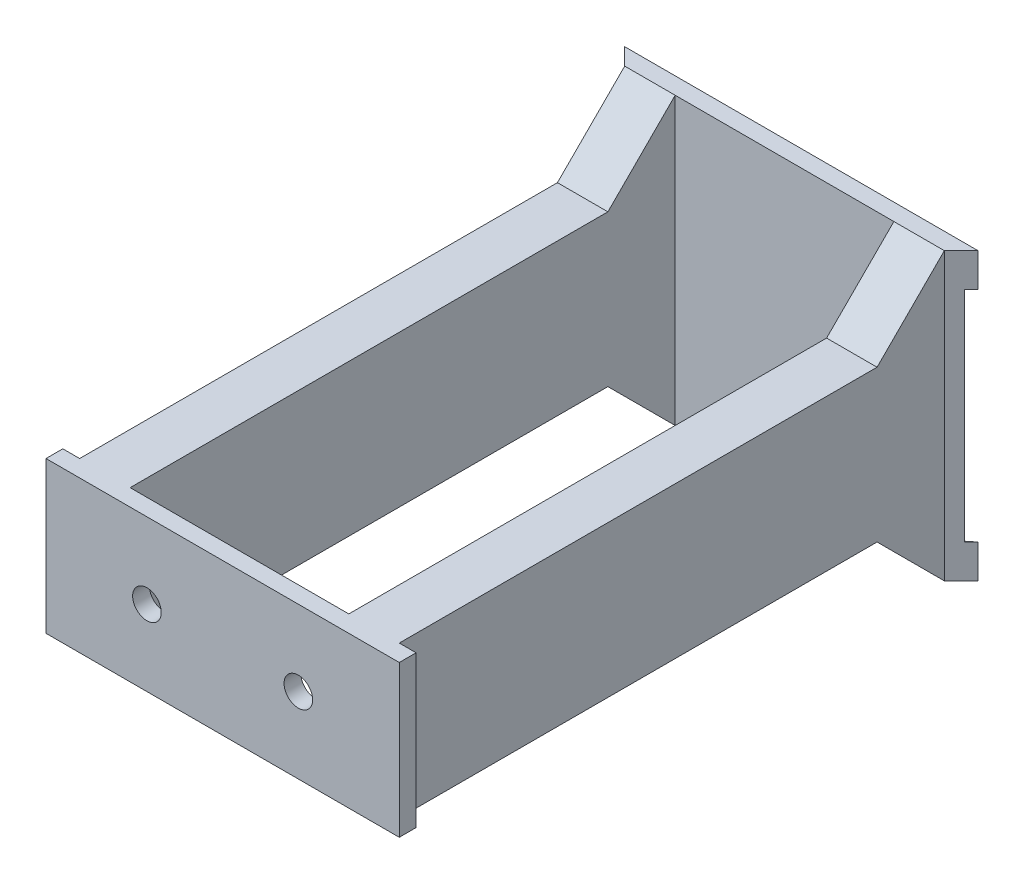
ISO-10303-21;
HEADER;
FILE_DESCRIPTION(('STEP AP214'),'2;1');
FILE_NAME('part.step','',(''),(''),'','','');
FILE_SCHEMA(('AUTOMOTIVE_DESIGN { 1 0 10303 214 1 1 1 1 }'));
ENDSEC;
DATA;
#1=APPLICATION_CONTEXT('core data for automotive mechanical design processes');
#2=APPLICATION_PROTOCOL_DEFINITION('international standard','automotive_design',2000,#1);
#3=PRODUCT_CONTEXT('',#1,'mechanical');
#4=PRODUCT('Part','Part','',(#3));
#5=PRODUCT_RELATED_PRODUCT_CATEGORY('part','',(#4));
#6=PRODUCT_DEFINITION_FORMATION('','',#4);
#7=PRODUCT_DEFINITION_CONTEXT('part definition',#1,'design');
#8=PRODUCT_DEFINITION('design','',#6,#7);
#9=PRODUCT_DEFINITION_SHAPE('','',#8);
#10=(LENGTH_UNIT() NAMED_UNIT(*) SI_UNIT(.MILLI.,.METRE.));
#11=(NAMED_UNIT(*) PLANE_ANGLE_UNIT() SI_UNIT($,.RADIAN.));
#12=(NAMED_UNIT(*) SI_UNIT($,.STERADIAN.) SOLID_ANGLE_UNIT());
#13=UNCERTAINTY_MEASURE_WITH_UNIT(LENGTH_MEASURE(1.E-05),#10,'distance_accuracy_value','');
#14=(GEOMETRIC_REPRESENTATION_CONTEXT(3) GLOBAL_UNCERTAINTY_ASSIGNED_CONTEXT((#13)) GLOBAL_UNIT_ASSIGNED_CONTEXT((#10,
#11,#12)) REPRESENTATION_CONTEXT('',''));
#15=CARTESIAN_POINT('',(0.,0.,0.));
#16=DIRECTION('',(0.,0.,1.));
#17=DIRECTION('',(1.,0.,0.));
#18=AXIS2_PLACEMENT_3D('',#15,#16,#17);
#19=CARTESIAN_POINT('',(-33.5000000000001,42.5,-33.5000000000002));
#20=DIRECTION('',(-0.707106781186546,0.,-0.707106781186548));
#21=DIRECTION('',(-0.707106781186549,0.,0.707106781186547));
#22=AXIS2_PLACEMENT_3D('',#19,#20,#21);
#23=PLANE('',#22);
#24=DIRECTION('',(0.707106781186549,0.,-0.707106781186547));
#25=VECTOR('',#24,1.);
#26=CARTESIAN_POINT('',(-33.5000000000001,-32.5,-33.5000000000002));
#27=LINE('',#26,#25);
#28=CARTESIAN_POINT('',(103.,-32.5,-170.));
#29=VERTEX_POINT('',#28);
#30=CARTESIAN_POINT('',(105.,-32.5,-172.));
#31=VERTEX_POINT('',#30);
#32=EDGE_CURVE('E225',#29,#31,#27,.T.);
#33=ORIENTED_EDGE('',*,*,#32,.F.);
#34=DIRECTION('',(0.,-1.,0.));
#35=VECTOR('',#34,1.);
#36=CARTESIAN_POINT('',(103.,42.5,-170.));
#37=LINE('',#36,#35);
#38=CARTESIAN_POINT('',(103.,32.5,-170.));
#39=VERTEX_POINT('',#38);
#40=EDGE_CURVE('E232',#39,#29,#37,.T.);
#41=ORIENTED_EDGE('',*,*,#40,.F.);
#42=DIRECTION('',(-0.707106781186549,0.,0.707106781186547));
#43=VECTOR('',#42,1.);
#44=CARTESIAN_POINT('',(-33.5000000000001,32.5,-33.5000000000002));
#45=LINE('',#44,#43);
#46=CARTESIAN_POINT('',(105.,32.5,-172.));
#47=VERTEX_POINT('',#46);
#48=EDGE_CURVE('E219',#47,#39,#45,.T.);
#49=ORIENTED_EDGE('',*,*,#48,.F.);
#50=CARTESIAN_POINT('',(105.,42.5,-172.));
#51=DIRECTION('',(0.,-1.,0.));
#52=VECTOR('',#51,1.);
#53=LINE('',#50,#52);
#54=CARTESIAN_POINT('',(105.,42.5,-172.));
#55=VERTEX_POINT('',#54);
#56=EDGE_CURVE('E406',#55,#47,#53,.T.);
#57=ORIENTED_EDGE('',*,*,#56,.F.);
#58=DIRECTION('',(0.707106781186549,0.,-0.707106781186547));
#59=VECTOR('',#58,1.);
#60=CARTESIAN_POINT('',(-33.5000000000001,42.5,-33.5000000000002));
#61=LINE('',#60,#59);
#62=CARTESIAN_POINT('',(100.,42.5,-167.));
#63=VERTEX_POINT('',#62);
#64=EDGE_CURVE('E319',#63,#55,#61,.T.);
#65=ORIENTED_EDGE('',*,*,#64,.F.);
#66=DIRECTION('',(0.,-1.,0.));
#67=VECTOR('',#66,1.);
#68=CARTESIAN_POINT('',(100.,42.5,-167.));
#69=LINE('',#68,#67);
#70=CARTESIAN_POINT('',(99.9999999999999,-42.5,-167.));
#71=VERTEX_POINT('',#70);
#72=EDGE_CURVE('E392',#63,#71,#69,.T.);
#73=ORIENTED_EDGE('',*,*,#72,.T.);
#74=DIRECTION('',(0.707106781186549,0.,-0.707106781186547));
#75=VECTOR('',#74,1.);
#76=CARTESIAN_POINT('',(-33.5000000000001,-42.5,-33.5000000000002));
#77=LINE('',#76,#75);
#78=CARTESIAN_POINT('',(105.,-42.5,-172.));
#79=VERTEX_POINT('',#78);
#80=EDGE_CURVE('E362',#71,#79,#77,.T.);
#81=ORIENTED_EDGE('',*,*,#80,.T.);
#82=CARTESIAN_POINT('',(105.,-32.5,-172.));
#83=DIRECTION('',(0.,-1.,0.));
#84=VECTOR('',#83,1.);
#85=LINE('',#82,#84);
#86=EDGE_CURVE('E87',#31,#79,#85,.T.);
#87=ORIENTED_EDGE('',*,*,#86,.F.);
#88=EDGE_LOOP('',(#33,#41,#49,#57,#65,#73,#81,#87));
#89=FACE_BOUND('',#88,.T.);
#90=ADVANCED_FACE('F47',(#89),#23,.F.);
#91=CARTESIAN_POINT('',(-42.9268292682925,0.,-53.6585365853653));
#92=DIRECTION('',(0.624695047554426,0.,0.780868809443029));
#93=DIRECTION('',(0.780868809443029,0.,-0.624695047554426));
#94=AXIS2_PLACEMENT_3D('',#91,#92,#93);
#95=PLANE('',#94);
#96=DIRECTION('',(-0.780868809443029,0.,0.624695047554426));
#97=VECTOR('',#96,1.);
#98=CARTESIAN_POINT('',(-42.9268292682925,-32.5,-53.6585365853653));
#99=LINE('',#98,#97);
#100=CARTESIAN_POINT('',(102.5,-32.5,-170.));
#101=VERTEX_POINT('',#100);
#102=EDGE_CURVE('E12',#31,#101,#99,.T.);
#103=ORIENTED_EDGE('',*,*,#102,.F.);
#104=ORIENTED_EDGE('',*,*,#86,.T.);
#105=DIRECTION('',(0.615457454896662,-0.615457454896665,-0.492365963917332));
#106=VECTOR('',#105,1.);
#107=CARTESIAN_POINT('',(102.5,-40.,-170.));
#108=LINE('',#107,#106);
#109=CARTESIAN_POINT('',(102.5,-40.,-170.));
#110=VERTEX_POINT('',#109);
#111=EDGE_CURVE('E540',#110,#79,#108,.T.);
#112=ORIENTED_EDGE('',*,*,#111,.F.);
#113=DIRECTION('',(0.,-1.,0.));
#114=VECTOR('',#113,1.);
#115=CARTESIAN_POINT('',(102.5,40.,-170.));
#116=LINE('',#115,#114);
#117=EDGE_CURVE('E51',#101,#110,#116,.T.);
#118=ORIENTED_EDGE('',*,*,#117,.F.);
#119=EDGE_LOOP('',(#103,#104,#112,#118));
#120=FACE_BOUND('',#119,.T.);
#121=ADVANCED_FACE('F277',(#120),#95,.F.);
#122=DIRECTION('',(0.780868809443029,0.,-0.624695047554426));
#123=VECTOR('',#122,1.);
#124=CARTESIAN_POINT('',(-42.9268292682925,32.5,-53.6585365853653));
#125=LINE('',#124,#123);
#126=CARTESIAN_POINT('',(102.5,32.5,-170.));
#127=VERTEX_POINT('',#126);
#128=EDGE_CURVE('E57',#127,#47,#125,.T.);
#129=ORIENTED_EDGE('',*,*,#128,.F.);
#130=CARTESIAN_POINT('',(102.5,40.,-170.));
#131=VERTEX_POINT('',#130);
#132=EDGE_CURVE('E235',#131,#127,#116,.T.);
#133=ORIENTED_EDGE('',*,*,#132,.F.);
#134=DIRECTION('',(0.615457454896662,0.615457454896665,-0.492365963917332));
#135=VECTOR('',#134,1.);
#136=CARTESIAN_POINT('',(102.5,40.,-170.));
#137=LINE('',#136,#135);
#138=EDGE_CURVE('E260',#131,#55,#137,.T.);
#139=ORIENTED_EDGE('',*,*,#138,.T.);
#140=ORIENTED_EDGE('',*,*,#56,.T.);
#141=EDGE_LOOP('',(#129,#133,#139,#140));
#142=FACE_BOUND('',#141,.T.);
#143=ADVANCED_FACE('F589',(#142),#95,.F.);
#144=CARTESIAN_POINT('',(86.,42.5,-85.9999999999989));
#145=DIRECTION('',(-0.707106781186552,0.,0.707106781186543));
#146=DIRECTION('',(0.707106781186543,0.,0.707106781186552));
#147=AXIS2_PLACEMENT_3D('',#144,#145,#146);
#148=PLANE('',#147);
#149=DIRECTION('',(-0.707106781186543,0.,-0.707106781186552));
#150=VECTOR('',#149,1.);
#151=CARTESIAN_POINT('',(86.,42.5,-85.9999999999989));
#152=LINE('',#151,#150);
#153=CARTESIAN_POINT('',(4.99999999999998,42.5,-167.));
#154=VERTEX_POINT('',#153);
#155=CARTESIAN_POINT('',(0.,42.5,-172.));
#156=VERTEX_POINT('',#155);
#157=EDGE_CURVE('E303',#154,#156,#152,.T.);
#158=ORIENTED_EDGE('',*,*,#157,.T.);
#159=DIRECTION('',(0.529812942826013,-0.662266178532524,0.529812942826019));
#160=VECTOR('',#159,1.);
#161=CARTESIAN_POINT('',(48.2807017543857,-17.8508771929829,-123.719298245614));
#162=LINE('',#161,#160);
#163=CARTESIAN_POINT('',(1.99999999999996,40.,-170.));
#164=VERTEX_POINT('',#163);
#165=EDGE_CURVE('E374',#156,#164,#162,.T.);
#166=ORIENTED_EDGE('',*,*,#165,.T.);
#167=DIRECTION('',(0.,-1.,0.));
#168=VECTOR('',#167,1.);
#169=CARTESIAN_POINT('',(1.99999999999997,42.5,-170.));
#170=LINE('',#169,#168);
#171=CARTESIAN_POINT('',(1.99999999999995,-40.,-170.));
#172=VERTEX_POINT('',#171);
#173=EDGE_CURVE('E377',#164,#172,#170,.T.);
#174=ORIENTED_EDGE('',*,*,#173,.T.);
#175=DIRECTION('',(0.529812942826013,0.662266178532524,0.529812942826019));
#176=VECTOR('',#175,1.);
#177=CARTESIAN_POINT('',(78.1052631578943,55.1315789473692,-93.8947368421047));
#178=LINE('',#177,#176);
#179=CARTESIAN_POINT('',(0.,-42.5,-172.));
#180=VERTEX_POINT('',#179);
#181=EDGE_CURVE('E490',#180,#172,#178,.T.);
#182=ORIENTED_EDGE('',*,*,#181,.F.);
#183=DIRECTION('',(-0.707106781186543,0.,-0.707106781186552));
#184=VECTOR('',#183,1.);
#185=CARTESIAN_POINT('',(86.,-42.5,-85.9999999999989));
#186=LINE('',#185,#184);
#187=CARTESIAN_POINT('',(4.99999999999997,-42.5,-167.));
#188=VERTEX_POINT('',#187);
#189=EDGE_CURVE('E348',#188,#180,#186,.T.);
#190=ORIENTED_EDGE('',*,*,#189,.F.);
#191=DIRECTION('',(0.,-1.,0.));
#192=VECTOR('',#191,1.);
#193=CARTESIAN_POINT('',(4.99999999999997,42.5,-167.));
#194=LINE('',#193,#192);
#195=EDGE_CURVE('E407',#154,#188,#194,.T.);
#196=ORIENTED_EDGE('',*,*,#195,.F.);
#197=EDGE_LOOP('',(#158,#166,#174,#182,#190,#196));
#198=FACE_BOUND('',#197,.T.);
#199=ADVANCED_FACE('F586',(#198),#148,.T.);
#200=CARTESIAN_POINT('',(100.,42.5,0.));
#201=DIRECTION('',(-1.,0.,0.));
#202=DIRECTION('',(0.,0.,1.));
#203=AXIS2_PLACEMENT_3D('',#200,#201,#202);
#204=PLANE('',#203);
#205=DIRECTION('',(0.,0.,-1.));
#206=VECTOR('',#205,1.);
#207=CARTESIAN_POINT('',(100.,-22.5,0.));
#208=LINE('',#207,#206);
#209=CARTESIAN_POINT('',(100.,-22.5,-5.));
#210=VERTEX_POINT('',#209);
#211=CARTESIAN_POINT('',(100.,-22.5,-147.));
#212=VERTEX_POINT('',#211);
#213=EDGE_CURVE('E468',#210,#212,#208,.T.);
#214=ORIENTED_EDGE('',*,*,#213,.T.);
#215=DIRECTION('',(0.,-0.707106781186549,-0.707106781186546));
#216=VECTOR('',#215,1.);
#217=CARTESIAN_POINT('',(100.,83.5000000000001,-41.0000000000003));
#218=LINE('',#217,#216);
#219=EDGE_CURVE('E471',#212,#71,#218,.T.);
#220=ORIENTED_EDGE('',*,*,#219,.T.);
#221=ORIENTED_EDGE('',*,*,#72,.F.);
#222=DIRECTION('',(0.,0.707106781186549,-0.707106781186546));
#223=VECTOR('',#222,1.);
#224=CARTESIAN_POINT('',(100.,-41.,-83.5000000000003));
#225=LINE('',#224,#223);
#226=CARTESIAN_POINT('',(100.,22.5,-147.));
#227=VERTEX_POINT('',#226);
#228=EDGE_CURVE('E74',#227,#63,#225,.T.);
#229=ORIENTED_EDGE('',*,*,#228,.F.);
#230=DIRECTION('',(0.,0.,-1.));
#231=VECTOR('',#230,1.);
#232=CARTESIAN_POINT('',(100.,22.5,0.));
#233=LINE('',#232,#231);
#234=CARTESIAN_POINT('',(100.,22.5,-5.));
#235=VERTEX_POINT('',#234);
#236=EDGE_CURVE('E435',#235,#227,#233,.T.);
#237=ORIENTED_EDGE('',*,*,#236,.F.);
#238=DIRECTION('',(0.,-1.,0.));
#239=VECTOR('',#238,1.);
#240=CARTESIAN_POINT('',(100.,42.5,-5.));
#241=LINE('',#240,#239);
#242=EDGE_CURVE('E396',#235,#210,#241,.T.);
#243=ORIENTED_EDGE('',*,*,#242,.T.);
#244=EDGE_LOOP('',(#214,#220,#221,#229,#237,#243));
#245=FACE_BOUND('',#244,.T.);
#246=ADVANCED_FACE('F599',(#245),#204,.F.);
#247=CARTESIAN_POINT('',(5.,42.5,0.));
#248=DIRECTION('',(-1.,0.,0.));
#249=DIRECTION('',(0.,0.,1.));
#250=AXIS2_PLACEMENT_3D('',#247,#248,#249);
#251=PLANE('',#250);
#252=DIRECTION('',(0.,-0.707106781186549,-0.707106781186546));
#253=VECTOR('',#252,1.);
#254=CARTESIAN_POINT('',(4.99999999999999,83.5000000000001,-41.0000000000003));
#255=LINE('',#254,#253);
#256=CARTESIAN_POINT('',(4.99999999999999,-22.5,-147.));
#257=VERTEX_POINT('',#256);
#258=EDGE_CURVE('E474',#257,#188,#255,.T.);
#259=ORIENTED_EDGE('',*,*,#258,.F.);
#260=DIRECTION('',(0.,0.,-1.));
#261=VECTOR('',#260,1.);
#262=CARTESIAN_POINT('',(5.,-22.5,0.));
#263=LINE('',#262,#261);
#264=CARTESIAN_POINT('',(5.,-22.5,-5.));
#265=VERTEX_POINT('',#264);
#266=EDGE_CURVE('E456',#265,#257,#263,.T.);
#267=ORIENTED_EDGE('',*,*,#266,.F.);
#268=DIRECTION('',(0.,-1.,0.));
#269=VECTOR('',#268,1.);
#270=CARTESIAN_POINT('',(5.,42.5,-5.));
#271=LINE('',#270,#269);
#272=CARTESIAN_POINT('',(5.,22.5,-5.));
#273=VERTEX_POINT('',#272);
#274=EDGE_CURVE('E410',#273,#265,#271,.T.);
#275=ORIENTED_EDGE('',*,*,#274,.F.);
#276=DIRECTION('',(0.,0.,-1.));
#277=VECTOR('',#276,1.);
#278=CARTESIAN_POINT('',(5.,22.5,0.));
#279=LINE('',#278,#277);
#280=CARTESIAN_POINT('',(4.99999999999996,22.5,-147.));
#281=VERTEX_POINT('',#280);
#282=EDGE_CURVE('E96',#273,#281,#279,.T.);
#283=ORIENTED_EDGE('',*,*,#282,.T.);
#284=DIRECTION('',(0.,0.707106781186549,-0.707106781186546));
#285=VECTOR('',#284,1.);
#286=CARTESIAN_POINT('',(4.99999999999998,-41.,-83.5000000000003));
#287=LINE('',#286,#285);
#288=EDGE_CURVE('E438',#281,#154,#287,.T.);
#289=ORIENTED_EDGE('',*,*,#288,.T.);
#290=ORIENTED_EDGE('',*,*,#195,.T.);
#291=EDGE_LOOP('',(#259,#267,#275,#283,#289,#290));
#292=FACE_BOUND('',#291,.T.);
#293=ADVANCED_FACE('F627',(#292),#251,.T.);
#294=CARTESIAN_POINT('',(0.,42.5,-5.));
#295=DIRECTION('',(0.,0.,-1.));
#296=DIRECTION('',(-1.,0.,0.));
#297=AXIS2_PLACEMENT_3D('',#294,#295,#296);
#298=PLANE('',#297);
#299=DIRECTION('',(1.,0.,0.));
#300=VECTOR('',#299,1.);
#301=CARTESIAN_POINT('',(0.,-22.5,-5.));
#302=LINE('',#301,#300);
#303=CARTESIAN_POINT('',(0.,-22.5,-5.));
#304=VERTEX_POINT('',#303);
#305=EDGE_CURVE('E459',#304,#265,#302,.T.);
#306=ORIENTED_EDGE('',*,*,#305,.F.);
#307=DIRECTION('',(0.,-1.,0.));
#308=VECTOR('',#307,1.);
#309=CARTESIAN_POINT('',(0.,42.5,-5.));
#310=LINE('',#309,#308);
#311=CARTESIAN_POINT('',(0.,22.5,-5.));
#312=VERTEX_POINT('',#311);
#313=EDGE_CURVE('E413',#312,#304,#310,.T.);
#314=ORIENTED_EDGE('',*,*,#313,.F.);
#315=DIRECTION('',(1.,0.,0.));
#316=VECTOR('',#315,1.);
#317=CARTESIAN_POINT('',(0.,22.5,-5.));
#318=LINE('',#317,#316);
#319=EDGE_CURVE('E428',#312,#273,#318,.T.);
#320=ORIENTED_EDGE('',*,*,#319,.T.);
#321=ORIENTED_EDGE('',*,*,#274,.T.);
#322=EDGE_LOOP('',(#306,#314,#320,#321));
#323=FACE_BOUND('',#322,.T.);
#324=ADVANCED_FACE('F629',(#323),#298,.T.);
#325=CARTESIAN_POINT('',(0.,42.5,0.));
#326=DIRECTION('',(-1.,0.,0.));
#327=DIRECTION('',(0.,0.,1.));
#328=AXIS2_PLACEMENT_3D('',#325,#326,#327);
#329=PLANE('',#328);
#330=DIRECTION('',(0.,0.,-1.));
#331=VECTOR('',#330,1.);
#332=CARTESIAN_POINT('',(0.,-22.5,0.));
#333=LINE('',#332,#331);
#334=CARTESIAN_POINT('',(0.,-22.5,0.));
#335=VERTEX_POINT('',#334);
#336=EDGE_CURVE('E488',#335,#304,#333,.T.);
#337=ORIENTED_EDGE('',*,*,#336,.F.);
#338=DIRECTION('',(0.,-1.,0.));
#339=VECTOR('',#338,1.);
#340=CARTESIAN_POINT('',(0.,42.5,0.));
#341=LINE('',#340,#339);
#342=CARTESIAN_POINT('',(0.,22.5,0.));
#343=VERTEX_POINT('',#342);
#344=EDGE_CURVE('E416',#343,#335,#341,.T.);
#345=ORIENTED_EDGE('',*,*,#344,.F.);
#346=DIRECTION('',(0.,0.,-1.));
#347=VECTOR('',#346,1.);
#348=CARTESIAN_POINT('',(0.,22.5,0.));
#349=LINE('',#348,#347);
#350=EDGE_CURVE('E453',#343,#312,#349,.T.);
#351=ORIENTED_EDGE('',*,*,#350,.T.);
#352=ORIENTED_EDGE('',*,*,#313,.T.);
#353=EDGE_LOOP('',(#337,#345,#351,#352));
#354=FACE_BOUND('',#353,.T.);
#355=ADVANCED_FACE('F634',(#354),#329,.T.);
#356=CARTESIAN_POINT('',(0.,42.5,0.));
#357=DIRECTION('',(0.,0.,-1.));
#358=DIRECTION('',(-1.,0.,0.));
#359=AXIS2_PLACEMENT_3D('',#356,#357,#358);
#360=PLANE('',#359);
#361=CARTESIAN_POINT('',(30.,0.,0.));
#362=DIRECTION('',(0.,0.,1.));
#363=DIRECTION('',(1.,0.,0.));
#364=AXIS2_PLACEMENT_3D('',#361,#362,#363);
#365=CIRCLE('',#364,4.25000000000001);
#366=CARTESIAN_POINT('',(34.25,0.,0.));
#367=VERTEX_POINT('',#366);
#368=EDGE_CURVE('E251',#367,#367,#365,.T.);
#369=ORIENTED_EDGE('',*,*,#368,.F.);
#370=EDGE_LOOP('',(#369));
#371=FACE_BOUND('',#370,.T.);
#372=CARTESIAN_POINT('',(75.,0.,0.));
#373=DIRECTION('',(0.,0.,1.));
#374=DIRECTION('',(1.,0.,0.));
#375=AXIS2_PLACEMENT_3D('',#372,#373,#374);
#376=CIRCLE('',#375,4.25000000000001);
#377=CARTESIAN_POINT('',(79.25,0.,0.));
#378=VERTEX_POINT('',#377);
#379=EDGE_CURVE('E239',#378,#378,#376,.T.);
#380=ORIENTED_EDGE('',*,*,#379,.F.);
#381=EDGE_LOOP('',(#380));
#382=FACE_BOUND('',#381,.T.);
#383=ORIENTED_EDGE('',*,*,#344,.T.);
#384=DIRECTION('',(-1.,0.,0.));
#385=VECTOR('',#384,1.);
#386=CARTESIAN_POINT('',(105.,-22.5,0.));
#387=LINE('',#386,#385);
#388=CARTESIAN_POINT('',(105.,-22.5,0.));
#389=VERTEX_POINT('',#388);
#390=EDGE_CURVE('E485',#389,#335,#387,.T.);
#391=ORIENTED_EDGE('',*,*,#390,.F.);
#392=DIRECTION('',(0.,-1.,0.));
#393=VECTOR('',#392,1.);
#394=CARTESIAN_POINT('',(105.,42.5,0.));
#395=LINE('',#394,#393);
#396=CARTESIAN_POINT('',(105.,22.5,0.));
#397=VERTEX_POINT('',#396);
#398=EDGE_CURVE('E419',#397,#389,#395,.T.);
#399=ORIENTED_EDGE('',*,*,#398,.F.);
#400=DIRECTION('',(-1.,0.,0.));
#401=VECTOR('',#400,1.);
#402=CARTESIAN_POINT('',(105.,22.5,0.));
#403=LINE('',#402,#401);
#404=EDGE_CURVE('E446',#397,#343,#403,.T.);
#405=ORIENTED_EDGE('',*,*,#404,.T.);
#406=EDGE_LOOP('',(#383,#391,#399,#405));
#407=FACE_BOUND('',#406,.T.);
#408=ADVANCED_FACE('F637',(#371,#382,#407),#360,.F.);
#409=CARTESIAN_POINT('',(105.,42.5,0.));
#410=DIRECTION('',(-1.,0.,0.));
#411=DIRECTION('',(0.,0.,1.));
#412=AXIS2_PLACEMENT_3D('',#409,#410,#411);
#413=PLANE('',#412);
#414=ORIENTED_EDGE('',*,*,#398,.T.);
#415=DIRECTION('',(0.,0.,-1.));
#416=VECTOR('',#415,1.);
#417=CARTESIAN_POINT('',(105.,-22.5,0.));
#418=LINE('',#417,#416);
#419=CARTESIAN_POINT('',(105.,-22.5,-5.));
#420=VERTEX_POINT('',#419);
#421=EDGE_CURVE('E487',#389,#420,#418,.T.);
#422=ORIENTED_EDGE('',*,*,#421,.T.);
#423=DIRECTION('',(0.,-1.,0.));
#424=VECTOR('',#423,1.);
#425=CARTESIAN_POINT('',(105.,42.5,-5.));
#426=LINE('',#425,#424);
#427=CARTESIAN_POINT('',(105.,22.5,-5.));
#428=VERTEX_POINT('',#427);
#429=EDGE_CURVE('E422',#428,#420,#426,.T.);
#430=ORIENTED_EDGE('',*,*,#429,.F.);
#431=DIRECTION('',(0.,0.,-1.));
#432=VECTOR('',#431,1.);
#433=CARTESIAN_POINT('',(105.,22.5,0.));
#434=LINE('',#433,#432);
#435=EDGE_CURVE('E452',#397,#428,#434,.T.);
#436=ORIENTED_EDGE('',*,*,#435,.F.);
#437=EDGE_LOOP('',(#414,#422,#430,#436));
#438=FACE_BOUND('',#437,.T.);
#439=ADVANCED_FACE('F642',(#438),#413,.F.);
#440=CARTESIAN_POINT('',(85.,42.5,0.));
#441=DIRECTION('',(-1.,0.,0.));
#442=DIRECTION('',(0.,0.,1.));
#443=AXIS2_PLACEMENT_3D('',#440,#441,#442);
#444=PLANE('',#443);
#445=DIRECTION('',(0.,-0.707106781186549,-0.707106781186546));
#446=VECTOR('',#445,1.);
#447=CARTESIAN_POINT('',(85.,83.5000000000001,-41.0000000000003));
#448=LINE('',#447,#446);
#449=CARTESIAN_POINT('',(85.,-22.5,-147.));
#450=VERTEX_POINT('',#449);
#451=CARTESIAN_POINT('',(85.,-42.5,-167.));
#452=VERTEX_POINT('',#451);
#453=EDGE_CURVE('E476',#450,#452,#448,.T.);
#454=ORIENTED_EDGE('',*,*,#453,.F.);
#455=DIRECTION('',(0.,0.,-1.));
#456=VECTOR('',#455,1.);
#457=CARTESIAN_POINT('',(85.,-22.5,0.));
#458=LINE('',#457,#456);
#459=CARTESIAN_POINT('',(85.,-22.5,-5.));
#460=VERTEX_POINT('',#459);
#461=EDGE_CURVE('E461',#460,#450,#458,.T.);
#462=ORIENTED_EDGE('',*,*,#461,.F.);
#463=DIRECTION('',(0.,-1.,0.));
#464=VECTOR('',#463,1.);
#465=CARTESIAN_POINT('',(85.,42.5,-5.));
#466=LINE('',#465,#464);
#467=CARTESIAN_POINT('',(85.,22.5,-5.));
#468=VERTEX_POINT('',#467);
#469=EDGE_CURVE('E393',#468,#460,#466,.T.);
#470=ORIENTED_EDGE('',*,*,#469,.F.);
#471=DIRECTION('',(0.,0.,-1.));
#472=VECTOR('',#471,1.);
#473=CARTESIAN_POINT('',(85.,22.5,0.));
#474=LINE('',#473,#472);
#475=CARTESIAN_POINT('',(85.,22.5,-147.));
#476=VERTEX_POINT('',#475);
#477=EDGE_CURVE('E103',#468,#476,#474,.T.);
#478=ORIENTED_EDGE('',*,*,#477,.T.);
#479=DIRECTION('',(0.,0.707106781186549,-0.707106781186546));
#480=VECTOR('',#479,1.);
#481=CARTESIAN_POINT('',(85.,-41.,-83.5000000000003));
#482=LINE('',#481,#480);
#483=CARTESIAN_POINT('',(85.,42.5,-167.));
#484=VERTEX_POINT('',#483);
#485=EDGE_CURVE('E441',#476,#484,#482,.T.);
#486=ORIENTED_EDGE('',*,*,#485,.T.);
#487=DIRECTION('',(0.,-1.,0.));
#488=VECTOR('',#487,1.);
#489=CARTESIAN_POINT('',(85.,42.5,-167.));
#490=LINE('',#489,#488);
#491=EDGE_CURVE('E306',#484,#452,#490,.T.);
#492=ORIENTED_EDGE('',*,*,#491,.T.);
#493=EDGE_LOOP('',(#454,#462,#470,#478,#486,#492));
#494=FACE_BOUND('',#493,.T.);
#495=ADVANCED_FACE('F49',(#494),#444,.T.);
#496=CARTESIAN_POINT('',(0.,42.5,-4.99999999999998));
#497=DIRECTION('',(0.,0.,-1.));
#498=DIRECTION('',(-1.,0.,0.));
#499=AXIS2_PLACEMENT_3D('',#496,#497,#498);
#500=PLANE('',#499);
#501=CARTESIAN_POINT('',(30.,0.,-4.99999999999998));
#502=DIRECTION('',(0.,0.,-1.));
#503=DIRECTION('',(-1.,0.,0.));
#504=AXIS2_PLACEMENT_3D('',#501,#502,#503);
#505=CIRCLE('',#504,4.25000000000001);
#506=CARTESIAN_POINT('',(25.75,0.,-4.99999999999998));
#507=VERTEX_POINT('',#506);
#508=EDGE_CURVE('E248',#507,#507,#505,.F.);
#509=ORIENTED_EDGE('',*,*,#508,.T.);
#510=EDGE_LOOP('',(#509));
#511=FACE_BOUND('',#510,.T.);
#512=CARTESIAN_POINT('',(75.,0.,-5.));
#513=DIRECTION('',(0.,0.,-1.));
#514=DIRECTION('',(-1.,0.,0.));
#515=AXIS2_PLACEMENT_3D('',#512,#513,#514);
#516=CIRCLE('',#515,4.25000000000001);
#517=CARTESIAN_POINT('',(70.75,0.,-5.));
#518=VERTEX_POINT('',#517);
#519=EDGE_CURVE('E242',#518,#518,#516,.F.);
#520=ORIENTED_EDGE('',*,*,#519,.T.);
#521=EDGE_LOOP('',(#520));
#522=FACE_BOUND('',#521,.T.);
#523=DIRECTION('',(1.,0.,0.));
#524=VECTOR('',#523,1.);
#525=CARTESIAN_POINT('',(0.,-22.5,-4.99999999999998));
#526=LINE('',#525,#524);
#527=CARTESIAN_POINT('',(20.,-22.5,-4.99999999999998));
#528=VERTEX_POINT('',#527);
#529=EDGE_CURVE('E463',#528,#460,#526,.T.);
#530=ORIENTED_EDGE('',*,*,#529,.F.);
#531=DIRECTION('',(0.,-1.,0.));
#532=VECTOR('',#531,1.);
#533=CARTESIAN_POINT('',(20.,42.5,-4.99999999999998));
#534=LINE('',#533,#532);
#535=CARTESIAN_POINT('',(20.,22.5,-4.99999999999998));
#536=VERTEX_POINT('',#535);
#537=EDGE_CURVE('E397',#536,#528,#534,.T.);
#538=ORIENTED_EDGE('',*,*,#537,.F.);
#539=DIRECTION('',(1.,0.,0.));
#540=VECTOR('',#539,1.);
#541=CARTESIAN_POINT('',(0.,22.5,-4.99999999999998));
#542=LINE('',#541,#540);
#543=EDGE_CURVE('E431',#536,#468,#542,.T.);
#544=ORIENTED_EDGE('',*,*,#543,.T.);
#545=ORIENTED_EDGE('',*,*,#469,.T.);
#546=EDGE_LOOP('',(#530,#538,#544,#545));
#547=FACE_BOUND('',#546,.T.);
#548=ADVANCED_FACE('F653',(#511,#522,#547),#500,.T.);
#549=CARTESIAN_POINT('',(20.,42.5,0.));
#550=DIRECTION('',(-1.,0.,0.));
#551=DIRECTION('',(0.,0.,1.));
#552=AXIS2_PLACEMENT_3D('',#549,#550,#551);
#553=PLANE('',#552);
#554=DIRECTION('',(0.,0.,-1.));
#555=VECTOR('',#554,1.);
#556=CARTESIAN_POINT('',(20.,-22.5,0.));
#557=LINE('',#556,#555);
#558=CARTESIAN_POINT('',(20.,-22.5,-147.));
#559=VERTEX_POINT('',#558);
#560=EDGE_CURVE('E465',#528,#559,#557,.T.);
#561=ORIENTED_EDGE('',*,*,#560,.T.);
#562=DIRECTION('',(0.,-0.707106781186549,-0.707106781186546));
#563=VECTOR('',#562,1.);
#564=CARTESIAN_POINT('',(20.,83.5000000000001,-41.0000000000003));
#565=LINE('',#564,#563);
#566=CARTESIAN_POINT('',(20.,-42.5,-167.));
#567=VERTEX_POINT('',#566);
#568=EDGE_CURVE('E478',#559,#567,#565,.T.);
#569=ORIENTED_EDGE('',*,*,#568,.T.);
#570=DIRECTION('',(0.,-1.,0.));
#571=VECTOR('',#570,1.);
#572=CARTESIAN_POINT('',(20.,42.5,-167.));
#573=LINE('',#572,#571);
#574=CARTESIAN_POINT('',(20.,42.5,-167.));
#575=VERTEX_POINT('',#574);
#576=EDGE_CURVE('E400',#575,#567,#573,.T.);
#577=ORIENTED_EDGE('',*,*,#576,.F.);
#578=DIRECTION('',(0.,0.707106781186549,-0.707106781186546));
#579=VECTOR('',#578,1.);
#580=CARTESIAN_POINT('',(20.,-41.,-83.5000000000003));
#581=LINE('',#580,#579);
#582=CARTESIAN_POINT('',(19.9999999999999,22.5,-147.));
#583=VERTEX_POINT('',#582);
#584=EDGE_CURVE('E444',#583,#575,#581,.T.);
#585=ORIENTED_EDGE('',*,*,#584,.F.);
#586=DIRECTION('',(0.,0.,-1.));
#587=VECTOR('',#586,1.);
#588=CARTESIAN_POINT('',(20.,22.5,0.));
#589=LINE('',#588,#587);
#590=EDGE_CURVE('E433',#536,#583,#589,.T.);
#591=ORIENTED_EDGE('',*,*,#590,.F.);
#592=ORIENTED_EDGE('',*,*,#537,.T.);
#593=EDGE_LOOP('',(#561,#569,#577,#585,#591,#592));
#594=FACE_BOUND('',#593,.T.);
#595=ADVANCED_FACE('F615',(#594),#553,.F.);
#596=CARTESIAN_POINT('',(0.,42.5,-4.99999999999998));
#597=DIRECTION('',(0.,0.,-1.));
#598=DIRECTION('',(-1.,0.,0.));
#599=AXIS2_PLACEMENT_3D('',#596,#597,#598);
#600=PLANE('',#599);
#601=DIRECTION('',(1.,0.,0.));
#602=VECTOR('',#601,1.);
#603=CARTESIAN_POINT('',(0.,-22.5,-4.99999999999998));
#604=LINE('',#603,#602);
#605=EDGE_CURVE('E381',#210,#420,#604,.T.);
#606=ORIENTED_EDGE('',*,*,#605,.F.);
#607=ORIENTED_EDGE('',*,*,#242,.F.);
#608=DIRECTION('',(1.,0.,0.));
#609=VECTOR('',#608,1.);
#610=CARTESIAN_POINT('',(0.,22.5,-4.99999999999998));
#611=LINE('',#610,#609);
#612=EDGE_CURVE('E386',#235,#428,#611,.T.);
#613=ORIENTED_EDGE('',*,*,#612,.T.);
#614=ORIENTED_EDGE('',*,*,#429,.T.);
#615=EDGE_LOOP('',(#606,#607,#613,#614));
#616=FACE_BOUND('',#615,.T.);
#617=ADVANCED_FACE('F332',(#616),#600,.T.);
#618=CARTESIAN_POINT('',(0.,42.5,0.));
#619=DIRECTION('',(0.,1.,0.));
#620=DIRECTION('',(0.,0.,1.));
#621=AXIS2_PLACEMENT_3D('',#618,#619,#620);
#622=PLANE('',#621);
#623=ORIENTED_EDGE('',*,*,#157,.F.);
#624=DIRECTION('',(1.,0.,0.));
#625=VECTOR('',#624,1.);
#626=CARTESIAN_POINT('',(0.,42.5,-167.));
#627=LINE('',#626,#625);
#628=EDGE_CURVE('E389',#154,#575,#627,.T.);
#629=ORIENTED_EDGE('',*,*,#628,.T.);
#630=DIRECTION('',(1.,0.,0.));
#631=VECTOR('',#630,1.);
#632=CARTESIAN_POINT('',(0.,42.5,-167.));
#633=LINE('',#632,#631);
#634=EDGE_CURVE('E355',#575,#484,#633,.T.);
#635=ORIENTED_EDGE('',*,*,#634,.T.);
#636=EDGE_CURVE('E390',#484,#63,#627,.T.);
#637=ORIENTED_EDGE('',*,*,#636,.T.);
#638=ORIENTED_EDGE('',*,*,#64,.T.);
#639=CARTESIAN_POINT('',(0.,42.5000000000001,-172.));
#640=DIRECTION('',(1.,0.,0.));
#641=VECTOR('',#640,1.);
#642=LINE('',#639,#641);
#643=EDGE_CURVE('E307',#156,#55,#642,.T.);
#644=ORIENTED_EDGE('',*,*,#643,.F.);
#645=EDGE_LOOP('',(#623,#629,#635,#637,#638,#644));
#646=FACE_BOUND('',#645,.T.);
#647=ADVANCED_FACE('F321',(#646),#622,.T.);
#648=CARTESIAN_POINT('',(0.,42.5,-167.));
#649=DIRECTION('',(0.,0.,-1.));
#650=DIRECTION('',(-1.,0.,0.));
#651=AXIS2_PLACEMENT_3D('',#648,#649,#650);
#652=PLANE('',#651);
#653=DIRECTION('',(1.,0.,0.));
#654=VECTOR('',#653,1.);
#655=CARTESIAN_POINT('',(0.,-42.5,-167.));
#656=LINE('',#655,#654);
#657=EDGE_CURVE('E365',#567,#452,#656,.T.);
#658=ORIENTED_EDGE('',*,*,#657,.T.);
#659=ORIENTED_EDGE('',*,*,#491,.F.);
#660=ORIENTED_EDGE('',*,*,#634,.F.);
#661=ORIENTED_EDGE('',*,*,#576,.T.);
#662=EDGE_LOOP('',(#658,#659,#660,#661));
#663=FACE_BOUND('',#662,.T.);
#664=ADVANCED_FACE('F331',(#663),#652,.F.);
#665=CARTESIAN_POINT('',(0.,-42.5,0.));
#666=DIRECTION('',(0.,1.,0.));
#667=DIRECTION('',(0.,0.,1.));
#668=AXIS2_PLACEMENT_3D('',#665,#666,#667);
#669=PLANE('',#668);
#670=ORIENTED_EDGE('',*,*,#80,.F.);
#671=DIRECTION('',(-1.,0.,0.));
#672=VECTOR('',#671,1.);
#673=CARTESIAN_POINT('',(0.,-42.5,-167.));
#674=LINE('',#673,#672);
#675=EDGE_CURVE('E383',#71,#452,#674,.T.);
#676=ORIENTED_EDGE('',*,*,#675,.T.);
#677=ORIENTED_EDGE('',*,*,#657,.F.);
#678=EDGE_CURVE('E384',#567,#188,#674,.T.);
#679=ORIENTED_EDGE('',*,*,#678,.T.);
#680=ORIENTED_EDGE('',*,*,#189,.T.);
#681=CARTESIAN_POINT('',(0.,-42.5,-172.));
#682=DIRECTION('',(1.,0.,0.));
#683=VECTOR('',#682,1.);
#684=LINE('',#681,#683);
#685=EDGE_CURVE('E356',#180,#79,#684,.T.);
#686=ORIENTED_EDGE('',*,*,#685,.T.);
#687=EDGE_LOOP('',(#670,#676,#677,#679,#680,#686));
#688=FACE_BOUND('',#687,.T.);
#689=ADVANCED_FACE('F335',(#688),#669,.F.);
#690=CARTESIAN_POINT('',(105.,22.5,0.));
#691=DIRECTION('',(0.,1.,0.));
#692=DIRECTION('',(0.,0.,1.));
#693=AXIS2_PLACEMENT_3D('',#690,#691,#692);
#694=PLANE('',#693);
#695=ORIENTED_EDGE('',*,*,#319,.F.);
#696=ORIENTED_EDGE('',*,*,#350,.F.);
#697=ORIENTED_EDGE('',*,*,#404,.F.);
#698=ORIENTED_EDGE('',*,*,#435,.T.);
#699=ORIENTED_EDGE('',*,*,#612,.F.);
#700=ORIENTED_EDGE('',*,*,#236,.T.);
#701=DIRECTION('',(-1.,0.,0.));
#702=VECTOR('',#701,1.);
#703=CARTESIAN_POINT('',(105.,22.5,-147.));
#704=LINE('',#703,#702);
#705=EDGE_CURVE('E449',#227,#476,#704,.T.);
#706=ORIENTED_EDGE('',*,*,#705,.T.);
#707=ORIENTED_EDGE('',*,*,#477,.F.);
#708=ORIENTED_EDGE('',*,*,#543,.F.);
#709=ORIENTED_EDGE('',*,*,#590,.T.);
#710=EDGE_CURVE('E450',#583,#281,#704,.T.);
#711=ORIENTED_EDGE('',*,*,#710,.T.);
#712=ORIENTED_EDGE('',*,*,#282,.F.);
#713=EDGE_LOOP('',(#695,#696,#697,#698,#699,#700,#706,#707,#708,#709,#711,#712));
#714=FACE_BOUND('',#713,.T.);
#715=ADVANCED_FACE('F333',(#714),#694,.T.);
#716=CARTESIAN_POINT('',(105.,22.5,-147.));
#717=DIRECTION('',(0.,0.707106781186546,0.707106781186549));
#718=DIRECTION('',(0.,-0.707106781186549,0.707106781186546));
#719=AXIS2_PLACEMENT_3D('',#716,#717,#718);
#720=PLANE('',#719);
#721=ORIENTED_EDGE('',*,*,#228,.T.);
#722=ORIENTED_EDGE('',*,*,#636,.F.);
#723=ORIENTED_EDGE('',*,*,#485,.F.);
#724=ORIENTED_EDGE('',*,*,#705,.F.);
#725=EDGE_LOOP('',(#721,#722,#723,#724));
#726=FACE_BOUND('',#725,.T.);
#727=ADVANCED_FACE('F646',(#726),#720,.T.);
#728=ORIENTED_EDGE('',*,*,#710,.F.);
#729=ORIENTED_EDGE('',*,*,#584,.T.);
#730=ORIENTED_EDGE('',*,*,#628,.F.);
#731=ORIENTED_EDGE('',*,*,#288,.F.);
#732=EDGE_LOOP('',(#728,#729,#730,#731));
#733=FACE_BOUND('',#732,.T.);
#734=ADVANCED_FACE('F650',(#733),#720,.T.);
#735=CARTESIAN_POINT('',(105.,-22.5,0.));
#736=DIRECTION('',(0.,1.,0.));
#737=DIRECTION('',(0.,0.,1.));
#738=AXIS2_PLACEMENT_3D('',#735,#736,#737);
#739=PLANE('',#738);
#740=ORIENTED_EDGE('',*,*,#266,.T.);
#741=DIRECTION('',(-1.,0.,0.));
#742=VECTOR('',#741,1.);
#743=CARTESIAN_POINT('',(105.,-22.5,-147.));
#744=LINE('',#743,#742);
#745=EDGE_CURVE('E482',#559,#257,#744,.T.);
#746=ORIENTED_EDGE('',*,*,#745,.F.);
#747=ORIENTED_EDGE('',*,*,#560,.F.);
#748=ORIENTED_EDGE('',*,*,#529,.T.);
#749=ORIENTED_EDGE('',*,*,#461,.T.);
#750=EDGE_CURVE('E481',#212,#450,#744,.T.);
#751=ORIENTED_EDGE('',*,*,#750,.F.);
#752=ORIENTED_EDGE('',*,*,#213,.F.);
#753=ORIENTED_EDGE('',*,*,#605,.T.);
#754=ORIENTED_EDGE('',*,*,#421,.F.);
#755=ORIENTED_EDGE('',*,*,#390,.T.);
#756=ORIENTED_EDGE('',*,*,#336,.T.);
#757=ORIENTED_EDGE('',*,*,#305,.T.);
#758=EDGE_LOOP('',(#740,#746,#747,#748,#749,#751,#752,#753,#754,#755,#756,#757));
#759=FACE_BOUND('',#758,.T.);
#760=ADVANCED_FACE('F565',(#759),#739,.F.);
#761=CARTESIAN_POINT('',(105.,-22.5,-147.));
#762=DIRECTION('',(0.,0.707106781186546,-0.707106781186549));
#763=DIRECTION('',(0.,0.707106781186549,0.707106781186546));
#764=AXIS2_PLACEMENT_3D('',#761,#762,#763);
#765=PLANE('',#764);
#766=ORIENTED_EDGE('',*,*,#750,.T.);
#767=ORIENTED_EDGE('',*,*,#453,.T.);
#768=ORIENTED_EDGE('',*,*,#675,.F.);
#769=ORIENTED_EDGE('',*,*,#219,.F.);
#770=EDGE_LOOP('',(#766,#767,#768,#769));
#771=FACE_BOUND('',#770,.T.);
#772=ADVANCED_FACE('F655',(#771),#765,.F.);
#773=ORIENTED_EDGE('',*,*,#258,.T.);
#774=ORIENTED_EDGE('',*,*,#678,.F.);
#775=ORIENTED_EDGE('',*,*,#568,.F.);
#776=ORIENTED_EDGE('',*,*,#745,.T.);
#777=EDGE_LOOP('',(#773,#774,#775,#776));
#778=FACE_BOUND('',#777,.T.);
#779=ADVANCED_FACE('F619',(#778),#765,.F.);
#780=CARTESIAN_POINT('',(0.,0.,-170.));
#781=DIRECTION('',(0.,0.,-1.));
#782=DIRECTION('',(-1.,0.,0.));
#783=AXIS2_PLACEMENT_3D('',#780,#781,#782);
#784=PLANE('',#783);
#785=DIRECTION('',(-1.,0.,0.));
#786=VECTOR('',#785,1.);
#787=CARTESIAN_POINT('',(105.0001,-32.5,-170.));
#788=LINE('',#787,#786);
#789=EDGE_CURVE('E226',#29,#101,#788,.T.);
#790=ORIENTED_EDGE('',*,*,#789,.T.);
#791=ORIENTED_EDGE('',*,*,#117,.T.);
#792=DIRECTION('',(-1.,0.,0.));
#793=VECTOR('',#792,1.);
#794=CARTESIAN_POINT('',(102.5,-40.,-170.));
#795=LINE('',#794,#793);
#796=EDGE_CURVE('E300',#110,#172,#795,.T.);
#797=ORIENTED_EDGE('',*,*,#796,.T.);
#798=ORIENTED_EDGE('',*,*,#173,.F.);
#799=DIRECTION('',(1.,0.,0.));
#800=VECTOR('',#799,1.);
#801=CARTESIAN_POINT('',(102.5,40.,-170.));
#802=LINE('',#801,#800);
#803=EDGE_CURVE('E297',#164,#131,#802,.T.);
#804=ORIENTED_EDGE('',*,*,#803,.T.);
#805=ORIENTED_EDGE('',*,*,#132,.T.);
#806=DIRECTION('',(-1.,0.,0.));
#807=VECTOR('',#806,1.);
#808=CARTESIAN_POINT('',(105.0001,32.5,-170.));
#809=LINE('',#808,#807);
#810=EDGE_CURVE('E65',#39,#127,#809,.T.);
#811=ORIENTED_EDGE('',*,*,#810,.F.);
#812=ORIENTED_EDGE('',*,*,#40,.T.);
#813=EDGE_LOOP('',(#790,#791,#797,#798,#804,#805,#811,#812));
#814=FACE_BOUND('',#813,.T.);
#815=ADVANCED_FACE('F231',(#814),#784,.T.);
#816=CARTESIAN_POINT('',(0.,-67.3170731707317,-84.1463414634146));
#817=DIRECTION('',(0.,-0.624695047554424,-0.78086880944303));
#818=DIRECTION('',(0.,0.78086880944303,-0.624695047554424));
#819=AXIS2_PLACEMENT_3D('',#816,#817,#818);
#820=PLANE('',#819);
#821=ORIENTED_EDGE('',*,*,#643,.T.);
#822=ORIENTED_EDGE('',*,*,#138,.F.);
#823=ORIENTED_EDGE('',*,*,#803,.F.);
#824=ORIENTED_EDGE('',*,*,#165,.F.);
#825=EDGE_LOOP('',(#821,#822,#823,#824));
#826=FACE_BOUND('',#825,.T.);
#827=ADVANCED_FACE('F263',(#826),#820,.T.);
#828=CARTESIAN_POINT('',(0.,67.3170731707317,-84.1463414634147));
#829=DIRECTION('',(0.,-0.624695047554424,0.78086880944303));
#830=DIRECTION('',(0.,-0.78086880944303,-0.624695047554424));
#831=AXIS2_PLACEMENT_3D('',#828,#829,#830);
#832=PLANE('',#831);
#833=ORIENTED_EDGE('',*,*,#181,.T.);
#834=ORIENTED_EDGE('',*,*,#796,.F.);
#835=ORIENTED_EDGE('',*,*,#111,.T.);
#836=ORIENTED_EDGE('',*,*,#685,.F.);
#837=EDGE_LOOP('',(#833,#834,#835,#836));
#838=FACE_BOUND('',#837,.T.);
#839=ADVANCED_FACE('F273',(#838),#832,.F.);
#840=CARTESIAN_POINT('',(75.,0.,-172.0011));
#841=DIRECTION('',(0.,0.,1.));
#842=DIRECTION('',(1.,0.,0.));
#843=AXIS2_PLACEMENT_3D('',#840,#841,#842);
#844=CYLINDRICAL_SURFACE('',#843,4.25000000000001);
#845=ORIENTED_EDGE('',*,*,#519,.F.);
#846=EDGE_LOOP('',(#845));
#847=FACE_BOUND('',#846,.T.);
#848=ORIENTED_EDGE('',*,*,#379,.T.);
#849=EDGE_LOOP('',(#848));
#850=FACE_BOUND('',#849,.T.);
#851=ADVANCED_FACE('F564',(#847,#850),#844,.F.);
#852=CARTESIAN_POINT('',(30.,0.,-172.0011));
#853=DIRECTION('',(0.,0.,1.));
#854=DIRECTION('',(1.,0.,0.));
#855=AXIS2_PLACEMENT_3D('',#852,#853,#854);
#856=CYLINDRICAL_SURFACE('',#855,4.25000000000001);
#857=ORIENTED_EDGE('',*,*,#508,.F.);
#858=EDGE_LOOP('',(#857));
#859=FACE_BOUND('',#858,.T.);
#860=ORIENTED_EDGE('',*,*,#368,.T.);
#861=EDGE_LOOP('',(#860));
#862=FACE_BOUND('',#861,.T.);
#863=ADVANCED_FACE('F685',(#859,#862),#856,.F.);
#864=CARTESIAN_POINT('',(105.0001,-32.5,-170.));
#865=DIRECTION('',(0.,1.,0.));
#866=DIRECTION('',(0.,0.,1.));
#867=AXIS2_PLACEMENT_3D('',#864,#865,#866);
#868=PLANE('',#867);
#869=ORIENTED_EDGE('',*,*,#32,.T.);
#870=ORIENTED_EDGE('',*,*,#102,.T.);
#871=ORIENTED_EDGE('',*,*,#789,.F.);
#872=EDGE_LOOP('',(#869,#870,#871));
#873=FACE_BOUND('',#872,.T.);
#874=ADVANCED_FACE('F820',(#873),#868,.T.);
#875=CARTESIAN_POINT('',(105.0001,32.5,-170.));
#876=DIRECTION('',(0.,-1.,0.));
#877=DIRECTION('',(0.,0.,-1.));
#878=AXIS2_PLACEMENT_3D('',#875,#876,#877);
#879=PLANE('',#878);
#880=ORIENTED_EDGE('',*,*,#48,.T.);
#881=ORIENTED_EDGE('',*,*,#810,.T.);
#882=ORIENTED_EDGE('',*,*,#128,.T.);
#883=EDGE_LOOP('',(#880,#881,#882));
#884=FACE_BOUND('',#883,.T.);
#885=ADVANCED_FACE('F220',(#884),#879,.T.);
#886=CLOSED_SHELL('',(#90,#121,#143,#199,#246,#293,#324,#355,#408,#439,#495,#548,#595,#617,#647,
#664,#689,#715,#727,#734,#760,#772,#779,#815,#827,#839,#851,#863,#874,#885));
#887=MANIFOLD_SOLID_BREP('B2',#886);
#888=ADVANCED_BREP_SHAPE_REPRESENTATION('',(#18,#887),#14);
#889=SHAPE_DEFINITION_REPRESENTATION(#9,#888);
ENDSEC;
END-ISO-10303-21;
